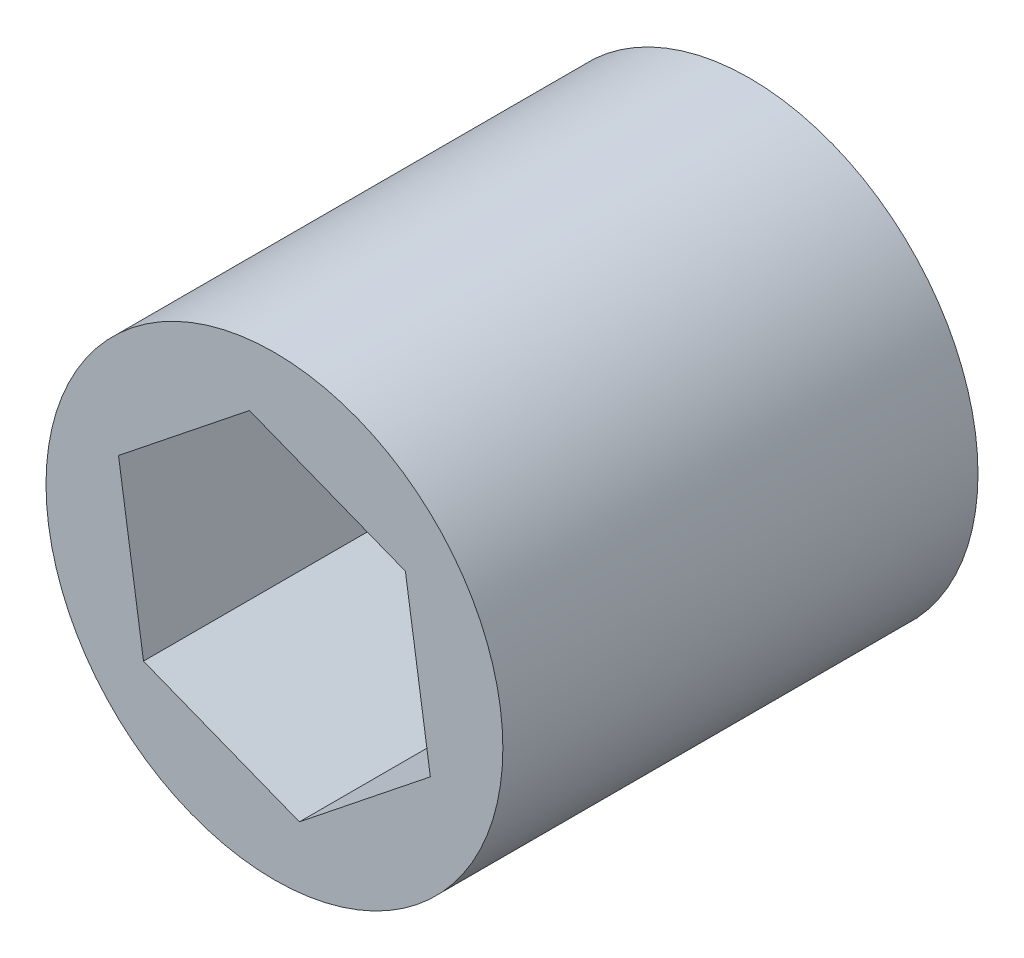
ISO-10303-21;
HEADER;
FILE_DESCRIPTION(('STEP AP214'),'2;1');
FILE_NAME('part.step','',(''),(''),'','','');
FILE_SCHEMA(('AUTOMOTIVE_DESIGN { 1 0 10303 214 1 1 1 1 }'));
ENDSEC;
DATA;
#1=APPLICATION_CONTEXT('core data for automotive mechanical design processes');
#2=APPLICATION_PROTOCOL_DEFINITION('international standard','automotive_design',2000,#1);
#3=PRODUCT_CONTEXT('',#1,'mechanical');
#4=PRODUCT('Part','Part','',(#3));
#5=PRODUCT_RELATED_PRODUCT_CATEGORY('part','',(#4));
#6=PRODUCT_DEFINITION_FORMATION('','',#4);
#7=PRODUCT_DEFINITION_CONTEXT('part definition',#1,'design');
#8=PRODUCT_DEFINITION('design','',#6,#7);
#9=PRODUCT_DEFINITION_SHAPE('','',#8);
#10=(LENGTH_UNIT() NAMED_UNIT(*) SI_UNIT(.MILLI.,.METRE.));
#11=(NAMED_UNIT(*) PLANE_ANGLE_UNIT() SI_UNIT($,.RADIAN.));
#12=(NAMED_UNIT(*) SI_UNIT($,.STERADIAN.) SOLID_ANGLE_UNIT());
#13=UNCERTAINTY_MEASURE_WITH_UNIT(LENGTH_MEASURE(1.E-05),#10,'distance_accuracy_value','');
#14=(GEOMETRIC_REPRESENTATION_CONTEXT(3) GLOBAL_UNCERTAINTY_ASSIGNED_CONTEXT((#13)) GLOBAL_UNIT_ASSIGNED_CONTEXT((#10,
#11,#12)) REPRESENTATION_CONTEXT('',''));
#15=CARTESIAN_POINT('',(0.,0.,0.));
#16=DIRECTION('',(0.,0.,1.));
#17=DIRECTION('',(1.,0.,0.));
#18=AXIS2_PLACEMENT_3D('',#15,#16,#17);
#19=CARTESIAN_POINT('',(0.,0.,20.8));
#20=DIRECTION('',(0.,0.,1.));
#21=DIRECTION('',(1.,0.,0.));
#22=AXIS2_PLACEMENT_3D('',#19,#20,#21);
#23=PLANE('',#22);
#24=CARTESIAN_POINT('',(0.,0.,20.8));
#25=DIRECTION('',(0.,0.,1.));
#26=DIRECTION('',(1.,0.,0.));
#27=AXIS2_PLACEMENT_3D('',#24,#25,#26);
#28=CIRCLE('',#27,10.);
#29=CARTESIAN_POINT('',(10.,0.,20.8));
#30=VERTEX_POINT('',#29);
#31=EDGE_CURVE('E11',#30,#30,#28,.T.);
#32=ORIENTED_EDGE('',*,*,#31,.T.);
#33=EDGE_LOOP('',(#32));
#34=FACE_BOUND('',#33,.T.);
#35=DIRECTION('',(0.149098832438353,-0.988822298578223,0.));
#36=VECTOR('',#35,1.);
#37=CARTESIAN_POINT('',(-6.82564389010202,2.6784172226982,20.8));
#38=LINE('',#37,#36);
#39=CARTESIAN_POINT('',(-6.82564389010202,2.6784172226982,20.8));
#40=VERTEX_POINT('',#39);
#41=CARTESIAN_POINT('',(-5.73239930184141,-4.57197239466529,20.8));
#42=VERTEX_POINT('',#41);
#43=EDGE_CURVE('E94',#40,#42,#38,.T.);
#44=ORIENTED_EDGE('',*,*,#43,.F.);
#45=DIRECTION('',(-0.781795814178085,-0.623534525855325,0.));
#46=VECTOR('',#45,1.);
#47=CARTESIAN_POINT('',(-1.09324458826061,7.25038961736349,20.8));
#48=LINE('',#47,#46);
#49=CARTESIAN_POINT('',(-1.09324458826061,7.25038961736349,20.8));
#50=VERTEX_POINT('',#49);
#51=EDGE_CURVE('E86',#50,#40,#48,.T.);
#52=ORIENTED_EDGE('',*,*,#51,.F.);
#53=DIRECTION('',(-0.930894646616439,0.365287772722898,0.));
#54=VECTOR('',#53,1.);
#55=CARTESIAN_POINT('',(5.73239930184141,4.57197239466529,20.8));
#56=LINE('',#55,#54);
#57=CARTESIAN_POINT('',(5.73239930184141,4.57197239466529,20.8));
#58=VERTEX_POINT('',#57);
#59=EDGE_CURVE('E114',#58,#50,#56,.T.);
#60=ORIENTED_EDGE('',*,*,#59,.F.);
#61=DIRECTION('',(-0.149098832438354,0.988822298578223,0.));
#62=VECTOR('',#61,1.);
#63=CARTESIAN_POINT('',(6.82564389010202,-2.6784172226982,20.8));
#64=LINE('',#63,#62);
#65=CARTESIAN_POINT('',(6.82564389010202,-2.6784172226982,20.8));
#66=VERTEX_POINT('',#65);
#67=EDGE_CURVE('E112',#66,#58,#64,.T.);
#68=ORIENTED_EDGE('',*,*,#67,.F.);
#69=DIRECTION('',(0.781795814178085,0.623534525855325,0.));
#70=VECTOR('',#69,1.);
#71=CARTESIAN_POINT('',(1.09324458826061,-7.25038961736348,20.8));
#72=LINE('',#71,#70);
#73=CARTESIAN_POINT('',(1.09324458826061,-7.25038961736348,20.8));
#74=VERTEX_POINT('',#73);
#75=EDGE_CURVE('E108',#74,#66,#72,.T.);
#76=ORIENTED_EDGE('',*,*,#75,.F.);
#77=DIRECTION('',(0.930894646616439,-0.365287772722898,0.));
#78=VECTOR('',#77,1.);
#79=CARTESIAN_POINT('',(-5.73239930184141,-4.57197239466529,20.8));
#80=LINE('',#79,#78);
#81=EDGE_CURVE('E106',#42,#74,#80,.T.);
#82=ORIENTED_EDGE('',*,*,#81,.F.);
#83=EDGE_LOOP('',(#44,#52,#60,#68,#76,#82));
#84=FACE_BOUND('',#83,.T.);
#85=ADVANCED_FACE('F33',(#34,#84),#23,.T.);
#86=CARTESIAN_POINT('',(0.,0.,0.));
#87=DIRECTION('',(0.,0.,1.));
#88=DIRECTION('',(1.,0.,0.));
#89=AXIS2_PLACEMENT_3D('',#86,#87,#88);
#90=PLANE('',#89);
#91=CARTESIAN_POINT('',(0.,0.,0.));
#92=DIRECTION('',(0.,0.,1.));
#93=DIRECTION('',(1.,0.,0.));
#94=AXIS2_PLACEMENT_3D('',#91,#92,#93);
#95=CIRCLE('',#94,10.);
#96=CARTESIAN_POINT('',(10.,0.,0.));
#97=VERTEX_POINT('',#96);
#98=EDGE_CURVE('E37',#97,#97,#95,.T.);
#99=ORIENTED_EDGE('',*,*,#98,.F.);
#100=EDGE_LOOP('',(#99));
#101=FACE_BOUND('',#100,.T.);
#102=DIRECTION('',(-0.781795814178085,-0.623534525855325,0.));
#103=VECTOR('',#102,1.);
#104=CARTESIAN_POINT('',(-1.09324458826061,7.25038961736349,0.));
#105=LINE('',#104,#103);
#106=CARTESIAN_POINT('',(-1.09324458826061,7.25038961736349,0.));
#107=VERTEX_POINT('',#106);
#108=CARTESIAN_POINT('',(-6.82564389010202,2.6784172226982,0.));
#109=VERTEX_POINT('',#108);
#110=EDGE_CURVE('E56',#107,#109,#105,.T.);
#111=ORIENTED_EDGE('',*,*,#110,.T.);
#112=DIRECTION('',(0.149098832438353,-0.988822298578223,0.));
#113=VECTOR('',#112,1.);
#114=CARTESIAN_POINT('',(-6.82564389010202,2.6784172226982,0.));
#115=LINE('',#114,#113);
#116=CARTESIAN_POINT('',(-5.73239930184141,-4.57197239466529,0.));
#117=VERTEX_POINT('',#116);
#118=EDGE_CURVE('E101',#109,#117,#115,.T.);
#119=ORIENTED_EDGE('',*,*,#118,.T.);
#120=DIRECTION('',(0.930894646616439,-0.365287772722898,0.));
#121=VECTOR('',#120,1.);
#122=CARTESIAN_POINT('',(-5.73239930184141,-4.57197239466529,0.));
#123=LINE('',#122,#121);
#124=CARTESIAN_POINT('',(1.09324458826061,-7.25038961736348,0.));
#125=VERTEX_POINT('',#124);
#126=EDGE_CURVE('E118',#117,#125,#123,.T.);
#127=ORIENTED_EDGE('',*,*,#126,.T.);
#128=DIRECTION('',(0.781795814178085,0.623534525855325,0.));
#129=VECTOR('',#128,1.);
#130=CARTESIAN_POINT('',(1.09324458826061,-7.25038961736348,0.));
#131=LINE('',#130,#129);
#132=CARTESIAN_POINT('',(6.82564389010202,-2.6784172226982,0.));
#133=VERTEX_POINT('',#132);
#134=EDGE_CURVE('E121',#125,#133,#131,.T.);
#135=ORIENTED_EDGE('',*,*,#134,.T.);
#136=DIRECTION('',(-0.149098832438354,0.988822298578223,0.));
#137=VECTOR('',#136,1.);
#138=CARTESIAN_POINT('',(6.82564389010202,-2.6784172226982,0.));
#139=LINE('',#138,#137);
#140=CARTESIAN_POINT('',(5.73239930184141,4.57197239466529,0.));
#141=VERTEX_POINT('',#140);
#142=EDGE_CURVE('E124',#133,#141,#139,.T.);
#143=ORIENTED_EDGE('',*,*,#142,.T.);
#144=DIRECTION('',(-0.930894646616439,0.365287772722898,0.));
#145=VECTOR('',#144,1.);
#146=CARTESIAN_POINT('',(5.73239930184141,4.57197239466529,0.));
#147=LINE('',#146,#145);
#148=EDGE_CURVE('E95',#141,#107,#147,.T.);
#149=ORIENTED_EDGE('',*,*,#148,.T.);
#150=EDGE_LOOP('',(#111,#119,#127,#135,#143,#149));
#151=FACE_BOUND('',#150,.T.);
#152=ADVANCED_FACE('F141',(#101,#151),#90,.F.);
#153=CARTESIAN_POINT('',(0.,0.,20.8));
#154=DIRECTION('',(0.,0.,-1.));
#155=DIRECTION('',(-1.,0.,0.));
#156=AXIS2_PLACEMENT_3D('',#153,#154,#155);
#157=CYLINDRICAL_SURFACE('',#156,10.);
#158=ORIENTED_EDGE('',*,*,#31,.F.);
#159=EDGE_LOOP('',(#158));
#160=FACE_BOUND('',#159,.T.);
#161=ORIENTED_EDGE('',*,*,#98,.T.);
#162=EDGE_LOOP('',(#161));
#163=FACE_BOUND('',#162,.T.);
#164=ADVANCED_FACE('F35',(#160,#163),#157,.T.);
#165=CARTESIAN_POINT('',(-1.09324458826061,7.25038961736349,20.8));
#166=DIRECTION('',(0.623534525855325,-0.781795814178085,0.));
#167=DIRECTION('',(0.781795814178085,0.623534525855325,0.));
#168=AXIS2_PLACEMENT_3D('',#165,#166,#167);
#169=PLANE('',#168);
#170=ORIENTED_EDGE('',*,*,#110,.F.);
#171=DIRECTION('',(0.,0.,-1.));
#172=VECTOR('',#171,1.);
#173=CARTESIAN_POINT('',(-1.09324458826061,7.25038961736349,20.8));
#174=LINE('',#173,#172);
#175=EDGE_CURVE('E90',#50,#107,#174,.T.);
#176=ORIENTED_EDGE('',*,*,#175,.F.);
#177=ORIENTED_EDGE('',*,*,#51,.T.);
#178=DIRECTION('',(0.,0.,-1.));
#179=VECTOR('',#178,1.);
#180=CARTESIAN_POINT('',(-6.82564389010202,2.6784172226982,20.8));
#181=LINE('',#180,#179);
#182=EDGE_CURVE('E89',#40,#109,#181,.T.);
#183=ORIENTED_EDGE('',*,*,#182,.T.);
#184=EDGE_LOOP('',(#170,#176,#177,#183));
#185=FACE_BOUND('',#184,.T.);
#186=ADVANCED_FACE('F88',(#185),#169,.T.);
#187=CARTESIAN_POINT('',(-6.82564389010202,2.6784172226982,20.8));
#188=DIRECTION('',(0.988822298578223,0.149098832438353,0.));
#189=DIRECTION('',(-0.149098832438353,0.988822298578223,0.));
#190=AXIS2_PLACEMENT_3D('',#187,#188,#189);
#191=PLANE('',#190);
#192=ORIENTED_EDGE('',*,*,#118,.F.);
#193=ORIENTED_EDGE('',*,*,#182,.F.);
#194=ORIENTED_EDGE('',*,*,#43,.T.);
#195=DIRECTION('',(0.,0.,-1.));
#196=VECTOR('',#195,1.);
#197=CARTESIAN_POINT('',(-5.73239930184141,-4.57197239466529,20.8));
#198=LINE('',#197,#196);
#199=EDGE_CURVE('E102',#42,#117,#198,.T.);
#200=ORIENTED_EDGE('',*,*,#199,.T.);
#201=EDGE_LOOP('',(#192,#193,#194,#200));
#202=FACE_BOUND('',#201,.T.);
#203=ADVANCED_FACE('F98',(#202),#191,.T.);
#204=CARTESIAN_POINT('',(-5.73239930184141,-4.57197239466529,20.8));
#205=DIRECTION('',(0.365287772722898,0.930894646616439,0.));
#206=DIRECTION('',(-0.930894646616439,0.365287772722898,0.));
#207=AXIS2_PLACEMENT_3D('',#204,#205,#206);
#208=PLANE('',#207);
#209=ORIENTED_EDGE('',*,*,#126,.F.);
#210=ORIENTED_EDGE('',*,*,#199,.F.);
#211=ORIENTED_EDGE('',*,*,#81,.T.);
#212=DIRECTION('',(0.,0.,-1.));
#213=VECTOR('',#212,1.);
#214=CARTESIAN_POINT('',(1.09324458826061,-7.25038961736348,20.8));
#215=LINE('',#214,#213);
#216=EDGE_CURVE('E133',#74,#125,#215,.T.);
#217=ORIENTED_EDGE('',*,*,#216,.T.);
#218=EDGE_LOOP('',(#209,#210,#211,#217));
#219=FACE_BOUND('',#218,.T.);
#220=ADVANCED_FACE('F137',(#219),#208,.T.);
#221=CARTESIAN_POINT('',(1.09324458826061,-7.25038961736348,20.8));
#222=DIRECTION('',(-0.623534525855325,0.781795814178085,0.));
#223=DIRECTION('',(-0.781795814178085,-0.623534525855325,0.));
#224=AXIS2_PLACEMENT_3D('',#221,#222,#223);
#225=PLANE('',#224);
#226=ORIENTED_EDGE('',*,*,#134,.F.);
#227=ORIENTED_EDGE('',*,*,#216,.F.);
#228=ORIENTED_EDGE('',*,*,#75,.T.);
#229=DIRECTION('',(0.,0.,-1.));
#230=VECTOR('',#229,1.);
#231=CARTESIAN_POINT('',(6.82564389010202,-2.6784172226982,20.8));
#232=LINE('',#231,#230);
#233=EDGE_CURVE('E131',#66,#133,#232,.T.);
#234=ORIENTED_EDGE('',*,*,#233,.T.);
#235=EDGE_LOOP('',(#226,#227,#228,#234));
#236=FACE_BOUND('',#235,.T.);
#237=ADVANCED_FACE('F149',(#236),#225,.T.);
#238=CARTESIAN_POINT('',(6.82564389010202,-2.6784172226982,20.8));
#239=DIRECTION('',(-0.988822298578223,-0.149098832438354,0.));
#240=DIRECTION('',(0.149098832438354,-0.988822298578223,0.));
#241=AXIS2_PLACEMENT_3D('',#238,#239,#240);
#242=PLANE('',#241);
#243=ORIENTED_EDGE('',*,*,#142,.F.);
#244=ORIENTED_EDGE('',*,*,#233,.F.);
#245=ORIENTED_EDGE('',*,*,#67,.T.);
#246=DIRECTION('',(0.,0.,-1.));
#247=VECTOR('',#246,1.);
#248=CARTESIAN_POINT('',(5.73239930184141,4.57197239466529,20.8));
#249=LINE('',#248,#247);
#250=EDGE_CURVE('E48',#58,#141,#249,.T.);
#251=ORIENTED_EDGE('',*,*,#250,.T.);
#252=EDGE_LOOP('',(#243,#244,#245,#251));
#253=FACE_BOUND('',#252,.T.);
#254=ADVANCED_FACE('F147',(#253),#242,.T.);
#255=CARTESIAN_POINT('',(5.73239930184141,4.57197239466529,20.8));
#256=DIRECTION('',(-0.365287772722898,-0.930894646616439,0.));
#257=DIRECTION('',(0.930894646616439,-0.365287772722898,0.));
#258=AXIS2_PLACEMENT_3D('',#255,#256,#257);
#259=PLANE('',#258);
#260=ORIENTED_EDGE('',*,*,#148,.F.);
#261=ORIENTED_EDGE('',*,*,#250,.F.);
#262=ORIENTED_EDGE('',*,*,#59,.T.);
#263=ORIENTED_EDGE('',*,*,#175,.T.);
#264=EDGE_LOOP('',(#260,#261,#262,#263));
#265=FACE_BOUND('',#264,.T.);
#266=ADVANCED_FACE('F143',(#265),#259,.T.);
#267=CLOSED_SHELL('',(#85,#152,#164,#186,#203,#220,#237,#254,#266));
#268=MANIFOLD_SOLID_BREP('B2',#267);
#269=ADVANCED_BREP_SHAPE_REPRESENTATION('',(#18,#268),#14);
#270=SHAPE_DEFINITION_REPRESENTATION(#9,#269);
ENDSEC;
END-ISO-10303-21;
